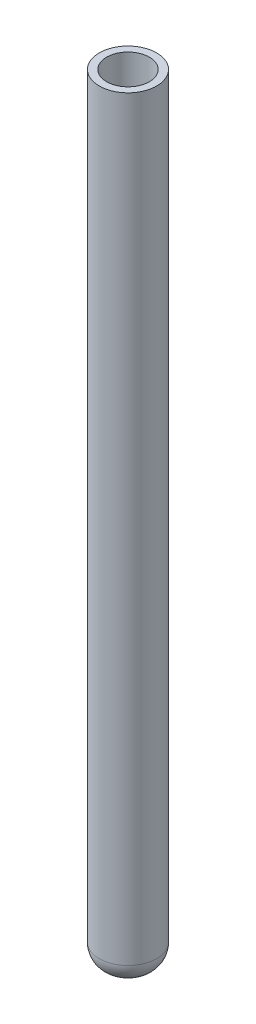
ISO-10303-21;
HEADER;
FILE_DESCRIPTION(('STEP AP214'),'2;1');
FILE_NAME('part.step','',(''),(''),'','','');
FILE_SCHEMA(('AUTOMOTIVE_DESIGN { 1 0 10303 214 1 1 1 1 }'));
ENDSEC;
DATA;
#1=APPLICATION_CONTEXT('core data for automotive mechanical design processes');
#2=APPLICATION_PROTOCOL_DEFINITION('international standard','automotive_design',2000,#1);
#3=PRODUCT_CONTEXT('',#1,'mechanical');
#4=PRODUCT('Part','Part','',(#3));
#5=PRODUCT_RELATED_PRODUCT_CATEGORY('part','',(#4));
#6=PRODUCT_DEFINITION_FORMATION('','',#4);
#7=PRODUCT_DEFINITION_CONTEXT('part definition',#1,'design');
#8=PRODUCT_DEFINITION('design','',#6,#7);
#9=PRODUCT_DEFINITION_SHAPE('','',#8);
#10=(LENGTH_UNIT() NAMED_UNIT(*) SI_UNIT(.MILLI.,.METRE.));
#11=(NAMED_UNIT(*) PLANE_ANGLE_UNIT() SI_UNIT($,.RADIAN.));
#12=(NAMED_UNIT(*) SI_UNIT($,.STERADIAN.) SOLID_ANGLE_UNIT());
#13=UNCERTAINTY_MEASURE_WITH_UNIT(LENGTH_MEASURE(1.E-05),#10,'distance_accuracy_value','');
#14=(GEOMETRIC_REPRESENTATION_CONTEXT(3) GLOBAL_UNCERTAINTY_ASSIGNED_CONTEXT((#13)) GLOBAL_UNIT_ASSIGNED_CONTEXT((#10,
#11,#12)) REPRESENTATION_CONTEXT('',''));
#15=CARTESIAN_POINT('',(0.,0.,0.));
#16=DIRECTION('',(0.,0.,1.));
#17=DIRECTION('',(1.,0.,0.));
#18=AXIS2_PLACEMENT_3D('',#15,#16,#17);
#19=CARTESIAN_POINT('',(0.,0.,-0.685));
#20=DIRECTION('',(0.,-1.,0.));
#21=DIRECTION('',(0.,0.,-1.));
#22=AXIS2_PLACEMENT_3D('',#19,#20,#21);
#23=PLANE('',#22);
#24=CARTESIAN_POINT('',(0.,0.,0.));
#25=DIRECTION('',(0.,1.,0.));
#26=DIRECTION('',(0.,0.,1.));
#27=AXIS2_PLACEMENT_3D('',#24,#25,#26);
#28=CIRCLE('',#27,0.510000000000002);
#29=CARTESIAN_POINT('',(0.,0.,0.510000000000005));
#30=VERTEX_POINT('',#29);
#31=EDGE_CURVE('E44',#30,#30,#28,.T.);
#32=ORIENTED_EDGE('',*,*,#31,.F.);
#33=EDGE_LOOP('',(#32));
#34=FACE_BOUND('',#33,.T.);
#35=CARTESIAN_POINT('',(0.,0.,0.));
#36=DIRECTION('',(0.,1.,0.));
#37=DIRECTION('',(0.,0.,1.));
#38=AXIS2_PLACEMENT_3D('',#35,#36,#37);
#39=CIRCLE('',#38,0.685000000000002);
#40=CARTESIAN_POINT('',(0.,0.,0.685000000000005));
#41=VERTEX_POINT('',#40);
#42=EDGE_CURVE('E53',#41,#41,#39,.T.);
#43=ORIENTED_EDGE('',*,*,#42,.T.);
#44=EDGE_LOOP('',(#43));
#45=FACE_BOUND('',#44,.T.);
#46=ADVANCED_FACE('F33',(#34,#45),#23,.F.);
#47=CARTESIAN_POINT('',(0.,-10.,0.));
#48=DIRECTION('',(0.,1.,0.));
#49=DIRECTION('',(0.,0.,1.));
#50=AXIS2_PLACEMENT_3D('',#47,#48,#49);
#51=CYLINDRICAL_SURFACE('',#50,0.510000000000002);
#52=CARTESIAN_POINT('',(0.,-10.,0.));
#53=DIRECTION('',(0.,1.,0.));
#54=DIRECTION('',(0.,0.,1.));
#55=AXIS2_PLACEMENT_3D('',#52,#53,#54);
#56=CIRCLE('',#55,0.510000000000002);
#57=CARTESIAN_POINT('',(0.,-10.,0.510000000000002));
#58=VERTEX_POINT('',#57);
#59=EDGE_CURVE('E48',#58,#58,#56,.T.);
#60=ORIENTED_EDGE('',*,*,#59,.F.);
#61=EDGE_LOOP('',(#60));
#62=FACE_BOUND('',#61,.T.);
#63=ORIENTED_EDGE('',*,*,#31,.T.);
#64=EDGE_LOOP('',(#63));
#65=FACE_BOUND('',#64,.T.);
#66=ADVANCED_FACE('F70',(#62,#65),#51,.F.);
#67=CARTESIAN_POINT('',(0.,-10.,-0.510000000000001));
#68=DIRECTION('',(0.,-1.,0.));
#69=DIRECTION('',(0.,0.,-1.));
#70=AXIS2_PLACEMENT_3D('',#67,#68,#69);
#71=PLANE('',#70);
#72=ORIENTED_EDGE('',*,*,#59,.T.);
#73=EDGE_LOOP('',(#72));
#74=FACE_BOUND('',#73,.T.);
#75=ADVANCED_FACE('F67',(#74),#71,.F.);
#76=CARTESIAN_POINT('',(0.,-18.54,0.));
#77=DIRECTION('',(0.,1.,0.));
#78=DIRECTION('',(0.,0.,1.));
#79=AXIS2_PLACEMENT_3D('',#76,#77,#78);
#80=PLANE('',#79);
#81=CARTESIAN_POINT('',(0.,-18.54,0.));
#82=DIRECTION('',(0.,1.,0.));
#83=DIRECTION('',(0.,0.,1.));
#84=AXIS2_PLACEMENT_3D('',#81,#82,#83);
#85=CIRCLE('',#84,0.185000000000001);
#86=CARTESIAN_POINT('',(0.,-18.54,0.185));
#87=VERTEX_POINT('',#86);
#88=EDGE_CURVE('E10',#87,#87,#85,.F.);
#89=ORIENTED_EDGE('',*,*,#88,.T.);
#90=EDGE_LOOP('',(#89));
#91=FACE_BOUND('',#90,.T.);
#92=ADVANCED_FACE('F60',(#91),#80,.F.);
#93=CARTESIAN_POINT('',(0.,-10.,0.));
#94=DIRECTION('',(0.,1.,0.));
#95=DIRECTION('',(0.,0.,1.));
#96=AXIS2_PLACEMENT_3D('',#93,#94,#95);
#97=CYLINDRICAL_SURFACE('',#96,0.685000000000001);
#98=CARTESIAN_POINT('',(0.,-18.04,0.));
#99=DIRECTION('',(0.,1.,0.));
#100=DIRECTION('',(0.,0.,1.));
#101=AXIS2_PLACEMENT_3D('',#98,#99,#100);
#102=CIRCLE('',#101,0.685000000000001);
#103=CARTESIAN_POINT('',(0.,-18.04,0.685));
#104=VERTEX_POINT('',#103);
#105=EDGE_CURVE('E40',#104,#104,#102,.T.);
#106=ORIENTED_EDGE('',*,*,#105,.T.);
#107=EDGE_LOOP('',(#106));
#108=FACE_BOUND('',#107,.T.);
#109=ORIENTED_EDGE('',*,*,#42,.F.);
#110=EDGE_LOOP('',(#109));
#111=FACE_BOUND('',#110,.T.);
#112=ADVANCED_FACE('F58',(#108,#111),#97,.T.);
#113=CARTESIAN_POINT('',(0.,-18.04,0.));
#114=DIRECTION('',(0.,1.,0.));
#115=DIRECTION('',(0.,0.,1.));
#116=AXIS2_PLACEMENT_3D('',#113,#114,#115);
#117=DEGENERATE_TOROIDAL_SURFACE('',#116,0.185000000000001,0.5,.T.);
#118=ORIENTED_EDGE('',*,*,#88,.F.);
#119=EDGE_LOOP('',(#118));
#120=FACE_BOUND('',#119,.T.);
#121=ORIENTED_EDGE('',*,*,#105,.F.);
#122=EDGE_LOOP('',(#121));
#123=FACE_BOUND('',#122,.T.);
#124=ADVANCED_FACE('F35',(#120,#123),#117,.T.);
#125=CLOSED_SHELL('',(#46,#66,#75,#92,#112,#124));
#126=MANIFOLD_SOLID_BREP('B2',#125);
#127=ADVANCED_BREP_SHAPE_REPRESENTATION('',(#18,#126),#14);
#128=SHAPE_DEFINITION_REPRESENTATION(#9,#127);
ENDSEC;
END-ISO-10303-21;
